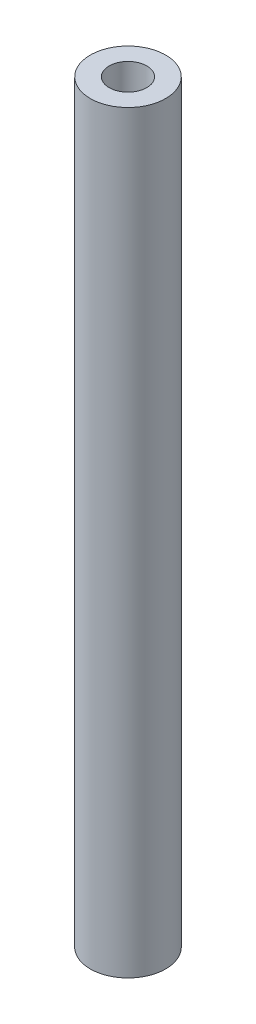
ISO-10303-21;
HEADER;
FILE_DESCRIPTION(('STEP AP214'),'2;1');
FILE_NAME('part.step','',(''),(''),'','','');
FILE_SCHEMA(('AUTOMOTIVE_DESIGN { 1 0 10303 214 1 1 1 1 }'));
ENDSEC;
DATA;
#1=APPLICATION_CONTEXT('core data for automotive mechanical design processes');
#2=APPLICATION_PROTOCOL_DEFINITION('international standard','automotive_design',2000,#1);
#3=PRODUCT_CONTEXT('',#1,'mechanical');
#4=PRODUCT('Part','Part','',(#3));
#5=PRODUCT_RELATED_PRODUCT_CATEGORY('part','',(#4));
#6=PRODUCT_DEFINITION_FORMATION('','',#4);
#7=PRODUCT_DEFINITION_CONTEXT('part definition',#1,'design');
#8=PRODUCT_DEFINITION('design','',#6,#7);
#9=PRODUCT_DEFINITION_SHAPE('','',#8);
#10=(LENGTH_UNIT() NAMED_UNIT(*) SI_UNIT(.MILLI.,.METRE.));
#11=(NAMED_UNIT(*) PLANE_ANGLE_UNIT() SI_UNIT($,.RADIAN.));
#12=(NAMED_UNIT(*) SI_UNIT($,.STERADIAN.) SOLID_ANGLE_UNIT());
#13=UNCERTAINTY_MEASURE_WITH_UNIT(LENGTH_MEASURE(1.E-05),#10,'distance_accuracy_value','');
#14=(GEOMETRIC_REPRESENTATION_CONTEXT(3) GLOBAL_UNCERTAINTY_ASSIGNED_CONTEXT((#13)) GLOBAL_UNIT_ASSIGNED_CONTEXT((#10,
#11,#12)) REPRESENTATION_CONTEXT('',''));
#15=CARTESIAN_POINT('',(0.,0.,0.));
#16=DIRECTION('',(0.,0.,1.));
#17=DIRECTION('',(1.,0.,0.));
#18=AXIS2_PLACEMENT_3D('',#15,#16,#17);
#19=CARTESIAN_POINT('',(0.,120.,0.));
#20=DIRECTION('',(0.,1.,0.));
#21=DIRECTION('',(0.,0.,1.));
#22=AXIS2_PLACEMENT_3D('',#19,#20,#21);
#23=PLANE('',#22);
#24=CARTESIAN_POINT('',(0.,120.,0.));
#25=DIRECTION('',(0.,1.,0.));
#26=DIRECTION('',(0.,0.,1.));
#27=AXIS2_PLACEMENT_3D('',#24,#25,#26);
#28=CIRCLE('',#27,6.);
#29=CARTESIAN_POINT('',(0.,120.,6.));
#30=VERTEX_POINT('',#29);
#31=EDGE_CURVE('E10',#30,#30,#28,.T.);
#32=ORIENTED_EDGE('',*,*,#31,.T.);
#33=EDGE_LOOP('',(#32));
#34=FACE_BOUND('',#33,.T.);
#35=CARTESIAN_POINT('',(0.,120.,0.));
#36=DIRECTION('',(0.,1.,0.));
#37=DIRECTION('',(0.,0.,1.));
#38=AXIS2_PLACEMENT_3D('',#35,#36,#37);
#39=CIRCLE('',#38,3.);
#40=CARTESIAN_POINT('',(0.,120.,3.));
#41=VERTEX_POINT('',#40);
#42=EDGE_CURVE('E43',#41,#41,#39,.T.);
#43=ORIENTED_EDGE('',*,*,#42,.F.);
#44=EDGE_LOOP('',(#43));
#45=FACE_BOUND('',#44,.T.);
#46=ADVANCED_FACE('F32',(#34,#45),#23,.T.);
#47=CARTESIAN_POINT('',(0.,0.,0.));
#48=DIRECTION('',(0.,1.,0.));
#49=DIRECTION('',(0.,0.,1.));
#50=AXIS2_PLACEMENT_3D('',#47,#48,#49);
#51=PLANE('',#50);
#52=CARTESIAN_POINT('',(0.,0.,0.));
#53=DIRECTION('',(0.,1.,0.));
#54=DIRECTION('',(0.,0.,1.));
#55=AXIS2_PLACEMENT_3D('',#52,#53,#54);
#56=CIRCLE('',#55,6.);
#57=CARTESIAN_POINT('',(0.,0.,6.));
#58=VERTEX_POINT('',#57);
#59=EDGE_CURVE('E36',#58,#58,#56,.T.);
#60=ORIENTED_EDGE('',*,*,#59,.F.);
#61=EDGE_LOOP('',(#60));
#62=FACE_BOUND('',#61,.T.);
#63=CARTESIAN_POINT('',(0.,0.,0.));
#64=DIRECTION('',(0.,1.,0.));
#65=DIRECTION('',(0.,0.,1.));
#66=AXIS2_PLACEMENT_3D('',#63,#64,#65);
#67=CIRCLE('',#66,3.);
#68=CARTESIAN_POINT('',(0.,0.,3.));
#69=VERTEX_POINT('',#68);
#70=EDGE_CURVE('E45',#69,#69,#67,.T.);
#71=ORIENTED_EDGE('',*,*,#70,.T.);
#72=EDGE_LOOP('',(#71));
#73=FACE_BOUND('',#72,.T.);
#74=ADVANCED_FACE('F55',(#62,#73),#51,.F.);
#75=CARTESIAN_POINT('',(0.,120.,0.));
#76=DIRECTION('',(0.,-1.,0.));
#77=DIRECTION('',(0.,0.,-1.));
#78=AXIS2_PLACEMENT_3D('',#75,#76,#77);
#79=CYLINDRICAL_SURFACE('',#78,6.);
#80=ORIENTED_EDGE('',*,*,#31,.F.);
#81=EDGE_LOOP('',(#80));
#82=FACE_BOUND('',#81,.T.);
#83=ORIENTED_EDGE('',*,*,#59,.T.);
#84=EDGE_LOOP('',(#83));
#85=FACE_BOUND('',#84,.T.);
#86=ADVANCED_FACE('F34',(#82,#85),#79,.T.);
#87=CARTESIAN_POINT('',(0.,120.,0.));
#88=DIRECTION('',(0.,-1.,0.));
#89=DIRECTION('',(0.,0.,-1.));
#90=AXIS2_PLACEMENT_3D('',#87,#88,#89);
#91=CYLINDRICAL_SURFACE('',#90,3.);
#92=ORIENTED_EDGE('',*,*,#42,.T.);
#93=EDGE_LOOP('',(#92));
#94=FACE_BOUND('',#93,.T.);
#95=ORIENTED_EDGE('',*,*,#70,.F.);
#96=EDGE_LOOP('',(#95));
#97=FACE_BOUND('',#96,.T.);
#98=ADVANCED_FACE('F51',(#94,#97),#91,.F.);
#99=CLOSED_SHELL('',(#46,#74,#86,#98));
#100=MANIFOLD_SOLID_BREP('B2',#99);
#101=ADVANCED_BREP_SHAPE_REPRESENTATION('',(#18,#100),#14);
#102=SHAPE_DEFINITION_REPRESENTATION(#9,#101);
ENDSEC;
END-ISO-10303-21;
